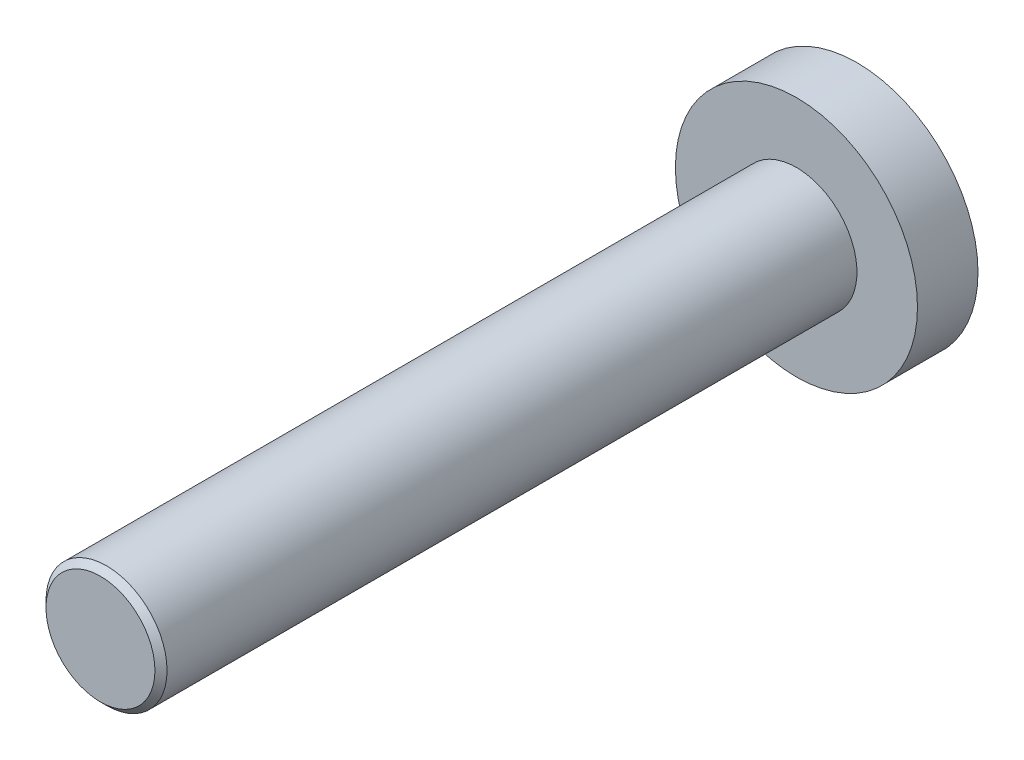
ISO-10303-21;
HEADER;
FILE_DESCRIPTION(('STEP AP214'),'2;1');
FILE_NAME('part.step','',(''),(''),'','','');
FILE_SCHEMA(('AUTOMOTIVE_DESIGN { 1 0 10303 214 1 1 1 1 }'));
ENDSEC;
DATA;
#1=APPLICATION_CONTEXT('core data for automotive mechanical design processes');
#2=APPLICATION_PROTOCOL_DEFINITION('international standard','automotive_design',2000,#1);
#3=PRODUCT_CONTEXT('',#1,'mechanical');
#4=PRODUCT('Part','Part','',(#3));
#5=PRODUCT_RELATED_PRODUCT_CATEGORY('part','',(#4));
#6=PRODUCT_DEFINITION_FORMATION('','',#4);
#7=PRODUCT_DEFINITION_CONTEXT('part definition',#1,'design');
#8=PRODUCT_DEFINITION('design','',#6,#7);
#9=PRODUCT_DEFINITION_SHAPE('','',#8);
#10=(LENGTH_UNIT() NAMED_UNIT(*) SI_UNIT(.MILLI.,.METRE.));
#11=(NAMED_UNIT(*) PLANE_ANGLE_UNIT() SI_UNIT($,.RADIAN.));
#12=(NAMED_UNIT(*) SI_UNIT($,.STERADIAN.) SOLID_ANGLE_UNIT());
#13=UNCERTAINTY_MEASURE_WITH_UNIT(LENGTH_MEASURE(1.E-05),#10,'distance_accuracy_value','');
#14=(GEOMETRIC_REPRESENTATION_CONTEXT(3) GLOBAL_UNCERTAINTY_ASSIGNED_CONTEXT((#13)) GLOBAL_UNIT_ASSIGNED_CONTEXT((#10,
#11,#12)) REPRESENTATION_CONTEXT('',''));
#15=CARTESIAN_POINT('',(0.,0.,0.));
#16=DIRECTION('',(0.,0.,1.));
#17=DIRECTION('',(1.,0.,0.));
#18=AXIS2_PLACEMENT_3D('',#15,#16,#17);
#19=CARTESIAN_POINT('',(0.,0.,23.));
#20=DIRECTION('',(0.,0.,-1.));
#21=DIRECTION('',(-1.,0.,0.));
#22=AXIS2_PLACEMENT_3D('',#19,#20,#21);
#23=CYLINDRICAL_SURFACE('',#22,2.);
#24=CARTESIAN_POINT('',(0.,0.,22.8));
#25=DIRECTION('',(0.,0.,1.));
#26=DIRECTION('',(1.,0.,0.));
#27=AXIS2_PLACEMENT_3D('',#24,#25,#26);
#28=CIRCLE('',#27,2.);
#29=CARTESIAN_POINT('',(2.,0.,22.8));
#30=VERTEX_POINT('',#29);
#31=EDGE_CURVE('E10',#30,#30,#28,.F.);
#32=ORIENTED_EDGE('',*,*,#31,.T.);
#33=EDGE_LOOP('',(#32));
#34=FACE_BOUND('',#33,.T.);
#35=CARTESIAN_POINT('',(0.,0.,0.));
#36=DIRECTION('',(0.,0.,-1.));
#37=DIRECTION('',(-1.,0.,0.));
#38=AXIS2_PLACEMENT_3D('',#35,#36,#37);
#39=CIRCLE('',#38,2.);
#40=CARTESIAN_POINT('',(-2.,0.,0.));
#41=VERTEX_POINT('',#40);
#42=EDGE_CURVE('E41',#41,#41,#39,.T.);
#43=ORIENTED_EDGE('',*,*,#42,.F.);
#44=EDGE_LOOP('',(#43));
#45=FACE_BOUND('',#44,.T.);
#46=ADVANCED_FACE('F30',(#34,#45),#23,.T.);
#47=CARTESIAN_POINT('',(0.,0.,23.));
#48=DIRECTION('',(0.,0.,1.));
#49=DIRECTION('',(1.,0.,0.));
#50=AXIS2_PLACEMENT_3D('',#47,#48,#49);
#51=PLANE('',#50);
#52=CARTESIAN_POINT('',(0.,0.,23.));
#53=DIRECTION('',(0.,0.,1.));
#54=DIRECTION('',(1.,0.,0.));
#55=AXIS2_PLACEMENT_3D('',#52,#53,#54);
#56=CIRCLE('',#55,1.8);
#57=CARTESIAN_POINT('',(1.8,0.,23.));
#58=VERTEX_POINT('',#57);
#59=EDGE_CURVE('E37',#58,#58,#56,.T.);
#60=ORIENTED_EDGE('',*,*,#59,.T.);
#61=EDGE_LOOP('',(#60));
#62=FACE_BOUND('',#61,.T.);
#63=ADVANCED_FACE('F65',(#62),#51,.T.);
#64=CARTESIAN_POINT('',(0.,0.,0.));
#65=DIRECTION('',(0.,0.,-1.));
#66=DIRECTION('',(-1.,0.,0.));
#67=AXIS2_PLACEMENT_3D('',#64,#65,#66);
#68=PLANE('',#67);
#69=CARTESIAN_POINT('',(0.,0.,0.));
#70=DIRECTION('',(0.,0.,-1.));
#71=DIRECTION('',(-1.,0.,0.));
#72=AXIS2_PLACEMENT_3D('',#69,#70,#71);
#73=CIRCLE('',#72,4.);
#74=CARTESIAN_POINT('',(-4.,0.,0.));
#75=VERTEX_POINT('',#74);
#76=EDGE_CURVE('E48',#75,#75,#73,.T.);
#77=ORIENTED_EDGE('',*,*,#76,.F.);
#78=EDGE_LOOP('',(#77));
#79=FACE_BOUND('',#78,.T.);
#80=ORIENTED_EDGE('',*,*,#42,.T.);
#81=EDGE_LOOP('',(#80));
#82=FACE_BOUND('',#81,.T.);
#83=ADVANCED_FACE('F59',(#79,#82),#68,.F.);
#84=CARTESIAN_POINT('',(0.,0.,-2.));
#85=DIRECTION('',(0.,0.,1.));
#86=DIRECTION('',(1.,0.,0.));
#87=AXIS2_PLACEMENT_3D('',#84,#85,#86);
#88=CYLINDRICAL_SURFACE('',#87,4.);
#89=CARTESIAN_POINT('',(0.,0.,-2.));
#90=DIRECTION('',(0.,0.,-1.));
#91=DIRECTION('',(-1.,0.,0.));
#92=AXIS2_PLACEMENT_3D('',#89,#90,#91);
#93=CIRCLE('',#92,4.);
#94=CARTESIAN_POINT('',(-4.,0.,-2.));
#95=VERTEX_POINT('',#94);
#96=EDGE_CURVE('E45',#95,#95,#93,.T.);
#97=ORIENTED_EDGE('',*,*,#96,.F.);
#98=EDGE_LOOP('',(#97));
#99=FACE_BOUND('',#98,.T.);
#100=ORIENTED_EDGE('',*,*,#76,.T.);
#101=EDGE_LOOP('',(#100));
#102=FACE_BOUND('',#101,.T.);
#103=ADVANCED_FACE('F56',(#99,#102),#88,.T.);
#104=CARTESIAN_POINT('',(0.,0.,-2.));
#105=DIRECTION('',(0.,0.,-1.));
#106=DIRECTION('',(-1.,0.,0.));
#107=AXIS2_PLACEMENT_3D('',#104,#105,#106);
#108=PLANE('',#107);
#109=ORIENTED_EDGE('',*,*,#96,.T.);
#110=EDGE_LOOP('',(#109));
#111=FACE_BOUND('',#110,.T.);
#112=ADVANCED_FACE('F54',(#111),#108,.T.);
#113=CARTESIAN_POINT('',(0.,0.,23.));
#114=DIRECTION('',(0.,0.,-1.));
#115=DIRECTION('',(-1.,0.,0.));
#116=AXIS2_PLACEMENT_3D('',#113,#114,#115);
#117=CONICAL_SURFACE('',#116,1.8,0.785398163397444);
#118=ORIENTED_EDGE('',*,*,#31,.F.);
#119=EDGE_LOOP('',(#118));
#120=FACE_BOUND('',#119,.T.);
#121=ORIENTED_EDGE('',*,*,#59,.F.);
#122=EDGE_LOOP('',(#121));
#123=FACE_BOUND('',#122,.T.);
#124=ADVANCED_FACE('F32',(#120,#123),#117,.T.);
#125=CLOSED_SHELL('',(#46,#63,#83,#103,#112,#124));
#126=MANIFOLD_SOLID_BREP('B2',#125);
#127=ADVANCED_BREP_SHAPE_REPRESENTATION('',(#18,#126),#14);
#128=SHAPE_DEFINITION_REPRESENTATION(#9,#127);
ENDSEC;
END-ISO-10303-21;
